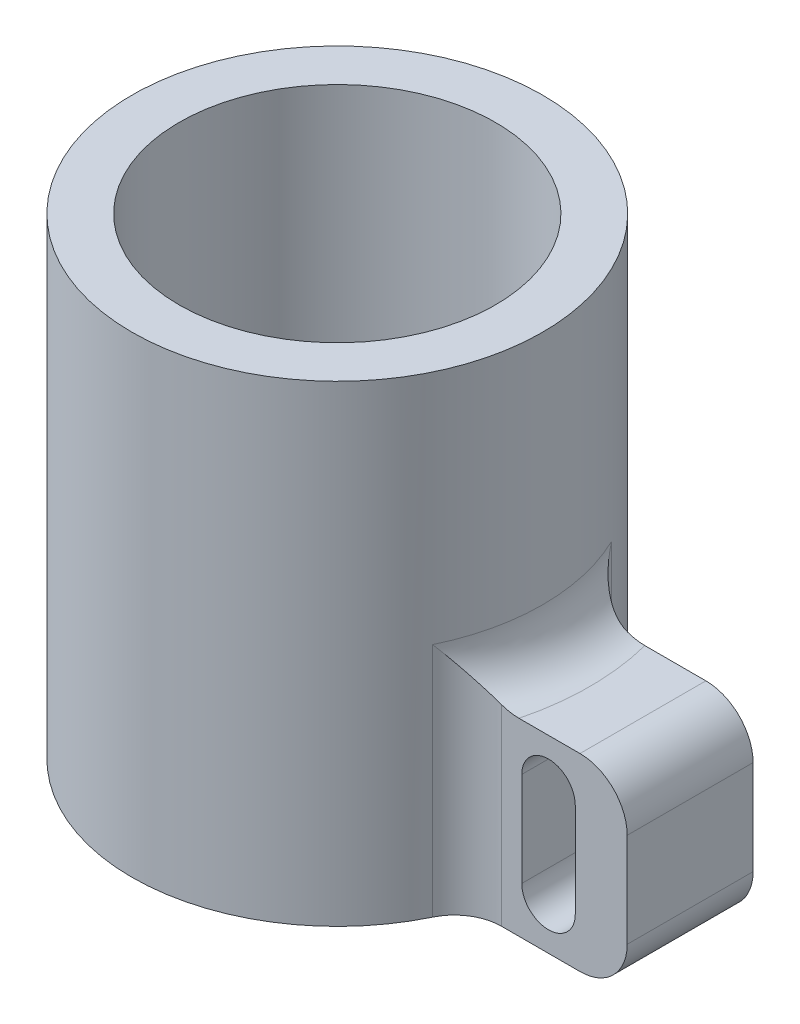
ISO-10303-21;
HEADER;
FILE_DESCRIPTION(('STEP AP214'),'2;1');
FILE_NAME('part.step','',(''),(''),'','','');
FILE_SCHEMA(('AUTOMOTIVE_DESIGN { 1 0 10303 214 1 1 1 1 }'));
ENDSEC;
DATA;
#1=APPLICATION_CONTEXT('core data for automotive mechanical design processes');
#2=APPLICATION_PROTOCOL_DEFINITION('international standard','automotive_design',2000,#1);
#3=PRODUCT_CONTEXT('',#1,'mechanical');
#4=PRODUCT('Part','Part','',(#3));
#5=PRODUCT_RELATED_PRODUCT_CATEGORY('part','',(#4));
#6=PRODUCT_DEFINITION_FORMATION('','',#4);
#7=PRODUCT_DEFINITION_CONTEXT('part definition',#1,'design');
#8=PRODUCT_DEFINITION('design','',#6,#7);
#9=PRODUCT_DEFINITION_SHAPE('','',#8);
#10=(LENGTH_UNIT() NAMED_UNIT(*) SI_UNIT(.MILLI.,.METRE.));
#11=(NAMED_UNIT(*) PLANE_ANGLE_UNIT() SI_UNIT($,.RADIAN.));
#12=(NAMED_UNIT(*) SI_UNIT($,.STERADIAN.) SOLID_ANGLE_UNIT());
#13=UNCERTAINTY_MEASURE_WITH_UNIT(LENGTH_MEASURE(1.E-05),#10,'distance_accuracy_value','');
#14=(GEOMETRIC_REPRESENTATION_CONTEXT(3) GLOBAL_UNCERTAINTY_ASSIGNED_CONTEXT((#13)) GLOBAL_UNIT_ASSIGNED_CONTEXT((#10,
#11,#12)) REPRESENTATION_CONTEXT('',''));
#15=CARTESIAN_POINT('',(0.,0.,0.));
#16=DIRECTION('',(0.,0.,1.));
#17=DIRECTION('',(1.,0.,0.));
#18=AXIS2_PLACEMENT_3D('',#15,#16,#17);
#19=CARTESIAN_POINT('',(0.,15.,0.));
#20=DIRECTION('',(0.,1.,0.));
#21=DIRECTION('',(0.,0.,1.));
#22=AXIS2_PLACEMENT_3D('',#19,#20,#21);
#23=PLANE('',#22);
#24=CARTESIAN_POINT('',(0.,15.,0.));
#25=DIRECTION('',(0.,1.,0.));
#26=DIRECTION('',(0.,0.,1.));
#27=AXIS2_PLACEMENT_3D('',#24,#25,#26);
#28=CIRCLE('',#27,13.05);
#29=CARTESIAN_POINT('',(0.,15.,13.05));
#30=VERTEX_POINT('',#29);
#31=EDGE_CURVE('E198',#30,#30,#28,.T.);
#32=ORIENTED_EDGE('',*,*,#31,.T.);
#33=EDGE_LOOP('',(#32));
#34=FACE_BOUND('',#33,.T.);
#35=CARTESIAN_POINT('',(0.,15.,0.));
#36=DIRECTION('',(0.,1.,0.));
#37=DIRECTION('',(0.,0.,1.));
#38=AXIS2_PLACEMENT_3D('',#35,#36,#37);
#39=CIRCLE('',#38,10.05);
#40=CARTESIAN_POINT('',(0.,15.,10.05));
#41=VERTEX_POINT('',#40);
#42=EDGE_CURVE('E192',#41,#41,#39,.T.);
#43=ORIENTED_EDGE('',*,*,#42,.F.);
#44=EDGE_LOOP('',(#43));
#45=FACE_BOUND('',#44,.T.);
#46=ADVANCED_FACE('F38',(#34,#45),#23,.T.);
#47=CARTESIAN_POINT('',(0.,-15.,0.));
#48=DIRECTION('',(0.,1.,0.));
#49=DIRECTION('',(0.,0.,1.));
#50=AXIS2_PLACEMENT_3D('',#47,#48,#49);
#51=PLANE('',#50);
#52=CARTESIAN_POINT('',(0.,-15.,0.));
#53=DIRECTION('',(0.,1.,0.));
#54=DIRECTION('',(0.,0.,1.));
#55=AXIS2_PLACEMENT_3D('',#52,#53,#54);
#56=CIRCLE('',#55,13.05);
#57=CARTESIAN_POINT('',(11.7434371928295,-15.,-5.69158878504673));
#58=VERTEX_POINT('',#57);
#59=CARTESIAN_POINT('',(11.7434371928295,-15.,5.69158878504673));
#60=VERTEX_POINT('',#59);
#61=EDGE_CURVE('E195',#58,#60,#56,.T.);
#62=ORIENTED_EDGE('',*,*,#61,.F.);
#63=CARTESIAN_POINT('',(14.4430779268132,-15.,-7.));
#64=DIRECTION('',(0.,1.,0.));
#65=DIRECTION('',(0.,0.,1.));
#66=AXIS2_PLACEMENT_3D('',#63,#64,#65);
#67=CIRCLE('',#66,3.);
#68=CARTESIAN_POINT('',(14.4430779268132,-15.,-4.));
#69=VERTEX_POINT('',#68);
#70=EDGE_CURVE('E244',#58,#69,#67,.T.);
#71=ORIENTED_EDGE('',*,*,#70,.T.);
#72=DIRECTION('',(1.,0.,0.));
#73=VECTOR('',#72,1.);
#74=CARTESIAN_POINT('',(12.4218557389788,-15.,-4.));
#75=LINE('',#74,#73);
#76=CARTESIAN_POINT('',(19.4218557389788,-15.,-4.));
#77=VERTEX_POINT('',#76);
#78=EDGE_CURVE('E182',#69,#77,#75,.T.);
#79=ORIENTED_EDGE('',*,*,#78,.T.);
#80=DIRECTION('',(0.,0.,1.));
#81=VECTOR('',#80,1.);
#82=CARTESIAN_POINT('',(19.4218557389788,-15.,0.));
#83=LINE('',#82,#81);
#84=CARTESIAN_POINT('',(19.4218557389788,-15.,4.));
#85=VERTEX_POINT('',#84);
#86=EDGE_CURVE('E212',#77,#85,#83,.T.);
#87=ORIENTED_EDGE('',*,*,#86,.T.);
#88=DIRECTION('',(1.,0.,0.));
#89=VECTOR('',#88,1.);
#90=CARTESIAN_POINT('',(12.4218557389788,-15.,4.));
#91=LINE('',#90,#89);
#92=CARTESIAN_POINT('',(14.4430779268132,-15.,4.));
#93=VERTEX_POINT('',#92);
#94=EDGE_CURVE('E186',#93,#85,#91,.T.);
#95=ORIENTED_EDGE('',*,*,#94,.F.);
#96=CARTESIAN_POINT('',(14.4430779268132,-15.,7.));
#97=DIRECTION('',(0.,1.,0.));
#98=DIRECTION('',(0.,0.,1.));
#99=AXIS2_PLACEMENT_3D('',#96,#97,#98);
#100=CIRCLE('',#99,3.);
#101=EDGE_CURVE('E11',#93,#60,#100,.T.);
#102=ORIENTED_EDGE('',*,*,#101,.T.);
#103=EDGE_LOOP('',(#62,#71,#79,#87,#95,#102));
#104=FACE_BOUND('',#103,.T.);
#105=CARTESIAN_POINT('',(0.,-15.,0.));
#106=DIRECTION('',(0.,1.,0.));
#107=DIRECTION('',(0.,0.,1.));
#108=AXIS2_PLACEMENT_3D('',#105,#106,#107);
#109=CIRCLE('',#108,10.05);
#110=CARTESIAN_POINT('',(0.,-15.,10.05));
#111=VERTEX_POINT('',#110);
#112=EDGE_CURVE('E181',#111,#111,#109,.T.);
#113=ORIENTED_EDGE('',*,*,#112,.T.);
#114=EDGE_LOOP('',(#113));
#115=FACE_BOUND('',#114,.T.);
#116=ADVANCED_FACE('F280',(#104,#115),#51,.F.);
#117=CARTESIAN_POINT('',(0.,15.,0.));
#118=DIRECTION('',(0.,-1.,0.));
#119=DIRECTION('',(0.,0.,-1.));
#120=AXIS2_PLACEMENT_3D('',#117,#118,#119);
#121=CYLINDRICAL_SURFACE('',#120,13.05);
#122=CARTESIAN_POINT('',(-13.05,-1.75,0.));
#123=CARTESIAN_POINT('',(-13.0499985563924,-1.74999588272326,-0.097827401796571));
#124=CARTESIAN_POINT('',(-13.0488883898653,-1.74176929995945,-0.195714439800495));
#125=CARTESIAN_POINT('',(-13.0445665203212,-1.70908409121789,-0.388760454522385));
#126=CARTESIAN_POINT('',(-13.0413526738031,-1.68460890870393,-0.483916545257475));
#127=CARTESIAN_POINT('',(-13.0331851953373,-1.62016416930917,-0.66867831504605));
#128=CARTESIAN_POINT('',(-13.0282327843927,-1.58020548453663,-0.75828783766368));
#129=CARTESIAN_POINT('',(-13.017137756471,-1.48595279800519,-0.929513509045821));
#130=CARTESIAN_POINT('',(-13.01099533027,-1.43166109352307,-1.01113093590114));
#131=CARTESIAN_POINT('',(-12.9981618599946,-1.30991833199,-1.16458562397635));
#132=CARTESIAN_POINT('',(-12.9914679230641,-1.24239493919249,-1.23636526187491));
#133=CARTESIAN_POINT('',(-12.9783089667916,-1.09626102076819,-1.36761021823294));
#134=CARTESIAN_POINT('',(-12.9718439596253,-1.01764990654525,-1.42707488253316));
#135=CARTESIAN_POINT('',(-12.9598465684176,-0.851192959395002,-1.5322200474085));
#136=CARTESIAN_POINT('',(-12.9543179170931,-0.763312331702198,-1.57784592653884));
#137=CARTESIAN_POINT('',(-12.9448579047174,-0.581049314963632,-1.65366947077376));
#138=CARTESIAN_POINT('',(-12.9409264740987,-0.486667209302252,-1.68386780784691));
#139=CARTESIAN_POINT('',(-12.9351339943286,-0.294681472163437,-1.72780254414692));
#140=CARTESIAN_POINT('',(-12.9332606489036,-0.197100600995333,-1.74163675133164));
#141=CARTESIAN_POINT('',(-12.9317589374786,-0.000985698294164454,-1.75275329817794));
#142=CARTESIAN_POINT('',(-12.9321304680065,0.0975482890982762,-1.75003640072308));
#143=CARTESIAN_POINT('',(-12.9350652782109,0.292087599064908,-1.72820802453727));
#144=CARTESIAN_POINT('',(-12.9376140997407,0.388105305492018,-1.70920469200651));
#145=CARTESIAN_POINT('',(-12.9445937446439,0.57557663636558,-1.65551180644757));
#146=CARTESIAN_POINT('',(-12.9490246113803,0.667030155597206,-1.62082189199352));
#147=CARTESIAN_POINT('',(-12.9592853522852,0.843110669259254,-1.53662561936111));
#148=CARTESIAN_POINT('',(-12.9651196136682,0.927715121420581,-1.48707267480534));
#149=CARTESIAN_POINT('',(-12.9775264610578,1.08744873107095,-1.37459024170368));
#150=CARTESIAN_POINT('',(-12.984099085886,1.1625773899008,-1.31166004965398));
#151=CARTESIAN_POINT('',(-12.9973062362529,1.30185418488781,-1.17361209018969));
#152=CARTESIAN_POINT('',(-13.0039408376435,1.36591003471435,-1.0984011858019));
#153=CARTESIAN_POINT('',(-13.0164755103772,1.48050295719231,-0.938246324079526));
#154=CARTESIAN_POINT('',(-13.0223755795617,1.53103999011333,-0.85330233814147));
#155=CARTESIAN_POINT('',(-13.0327808809671,1.61716238429306,-0.676018364287251));
#156=CARTESIAN_POINT('',(-13.0372855309784,1.65274150687982,-0.58367530943374));
#157=CARTESIAN_POINT('',(-13.0443873280105,1.70786247473842,-0.394251517513212));
#158=CARTESIAN_POINT('',(-13.0469845779027,1.72740518490598,-0.2971710362502));
#159=CARTESIAN_POINT('',(-13.0499654790284,1.74977790693332,-0.101825596970833));
#160=CARTESIAN_POINT('',(-13.0503659562746,1.75273495932226,-0.00357543564964309));
#161=CARTESIAN_POINT('',(-13.0489537469753,1.74218835492154,0.192019134335603));
#162=CARTESIAN_POINT('',(-13.0471411148556,1.72868510293126,0.289363565214478));
#163=CARTESIAN_POINT('',(-13.041516801374,1.68570677807283,0.480005147109601));
#164=CARTESIAN_POINT('',(-13.037712760178,1.65629273369958,0.573316301055459));
#165=CARTESIAN_POINT('',(-13.02853123152,1.58239154117193,0.753681878210108));
#166=CARTESIAN_POINT('',(-13.0231536834043,1.53790381196356,0.840736060070989));
#167=CARTESIAN_POINT('',(-13.0113820494466,1.43481393524855,1.00668092740599));
#168=CARTESIAN_POINT('',(-13.0049821597743,1.37613015467847,1.08552048104847));
#169=CARTESIAN_POINT('',(-12.9918987245024,1.24642884481754,1.23227681255569));
#170=CARTESIAN_POINT('',(-12.9852151658812,1.17541074886094,1.30019308830461));
#171=CARTESIAN_POINT('',(-12.9722652549825,1.02249504889266,1.42362968666842));
#172=CARTESIAN_POINT('',(-12.9660019388115,0.940528902727793,1.47906546353303));
#173=CARTESIAN_POINT('',(-12.9546529493295,0.768374201612131,1.57538214282873));
#174=CARTESIAN_POINT('',(-12.9495672494714,0.678185832078578,1.61626337337371));
#175=CARTESIAN_POINT('',(-12.9411704816567,0.492412470678718,1.68217560615089));
#176=CARTESIAN_POINT('',(-12.9378542037258,0.396844248525525,1.70725318139243));
#177=CARTESIAN_POINT('',(-12.9333572079728,0.202805556244793,1.74099566574198));
#178=CARTESIAN_POINT('',(-12.9321763744965,0.104335243586077,1.74966146370188));
#179=CARTESIAN_POINT('',(-12.9320876739287,-0.0918708145439395,1.75031642878322));
#180=CARTESIAN_POINT('',(-12.9331616993896,-0.18960613471769,1.74243844912948));
#181=CARTESIAN_POINT('',(-12.9374226271253,-0.382349614010556,1.71051197355238));
#182=CARTESIAN_POINT('',(-12.9406095285059,-0.47735777428387,1.68646348447288));
#183=CARTESIAN_POINT('',(-12.9487312728053,-0.661925825307327,1.62292209009637));
#184=CARTESIAN_POINT('',(-12.9536652778111,-0.751488303728082,1.58343658746566));
#185=CARTESIAN_POINT('',(-12.9647265380302,-0.922738176217012,1.49015507277252));
#186=CARTESIAN_POINT('',(-12.9708538170472,-1.00442541313879,1.43635877522602));
#187=CARTESIAN_POINT('',(-12.9836700808909,-1.15828383083422,1.31549319923627));
#188=CARTESIAN_POINT('',(-12.9903630211887,-1.23037704171104,1.24832507820943));
#189=CARTESIAN_POINT('',(-13.003522196318,-1.36231821730162,1.10283023224923));
#190=CARTESIAN_POINT('',(-13.0099883776229,-1.42216330675182,1.02450089450814));
#191=CARTESIAN_POINT('',(-13.0219971273949,-1.52813658666539,0.85851019141404));
#192=CARTESIAN_POINT('',(-13.0275355360871,-1.57420368993159,0.770809540041309));
#193=CARTESIAN_POINT('',(-13.0370231811908,-1.65088872495103,0.588888569305103));
#194=CARTESIAN_POINT('',(-13.0409741158691,-1.68152317538436,0.494675344226775));
#195=CARTESIAN_POINT('',(-13.0459064574379,-1.7192709163097,0.333330013068887));
#196=CARTESIAN_POINT('',(-13.0474339196314,-1.73077740659693,0.267208467457927));
#197=CARTESIAN_POINT('',(-13.0494811810959,-1.74614332508655,0.134067280116709));
#198=CARTESIAN_POINT('',(-13.0500009894006,-1.75000282184449,0.0670476464432641));
#199=CARTESIAN_POINT('',(-13.05,-1.75,0.));
#200=B_SPLINE_CURVE_WITH_KNOTS('',3,(#122,#123,#124,#125,#126,#127,#128,#129,#130,#131,#132,
#133,#134,#135,#136,#137,#138,#139,#140,#141,#142,#143,#144,#145,#146,#147,#148,#149,#150,#151,
#152,#153,#154,#155,#156,#157,#158,#159,#160,#161,#162,#163,#164,#165,#166,#167,#168,#169,#170,
#171,#172,#173,#174,#175,#176,#177,#178,#179,#180,#181,#182,#183,#184,#185,#186,#187,#188,#189,
#190,#191,#192,#193,#194,#195,#196,#197,#198,#199),.UNSPECIFIED.,.T.,.F.,(4,2,2,2,2,2,2,2,2,2,2,
2,2,2,2,2,2,2,2,2,2,2,2,2,2,2,2,2,2,2,2,2,2,2,2,2,2,2,4),(0.,0.293237269596652,
0.586773793314364,0.880104575816512,1.17338837217571,1.46832264274902,1.76327257592389,
2.05937195987793,2.35545844570166,2.64976614182797,2.94406027264798,3.2364152215197,
3.52877690672338,3.82206471441829,4.11536794981299,4.4110087957341,4.7066505105033,
5.00241541000949,5.29816435690692,5.59164484074128,5.88511810731402,6.17747360874801,
6.46984038105926,6.76393010823039,7.05803335011035,7.35407267315812,7.65010532194988,
7.94526143873537,8.24040156958768,8.53318067238647,8.82595965127237,9.11859840278422,
9.41124299254371,9.70613695318201,10.0011000613844,10.2973521892932,10.5932865398468,
10.7942634101059,10.9952384785922),.UNSPECIFIED.);
#201=CARTESIAN_POINT('',(-13.05,-1.75,0.));
#202=VERTEX_POINT('',#201);
#203=EDGE_CURVE('E291',#202,#202,#200,.T.);
#204=ORIENTED_EDGE('',*,*,#203,.T.);
#205=EDGE_LOOP('',(#204));
#206=FACE_BOUND('',#205,.T.);
#207=ORIENTED_EDGE('',*,*,#31,.F.);
#208=EDGE_LOOP('',(#207));
#209=FACE_BOUND('',#208,.T.);
#210=CARTESIAN_POINT('',(0.,0.,0.));
#211=DIRECTION('',(0.,1.,0.));
#212=DIRECTION('',(0.,0.,1.));
#213=AXIS2_PLACEMENT_3D('',#210,#211,#212);
#214=CIRCLE('',#213,13.05);
#215=CARTESIAN_POINT('',(11.7434371928295,0.,5.69158878504673));
#216=VERTEX_POINT('',#215);
#217=CARTESIAN_POINT('',(11.7434371928295,0.,-5.69158878504673));
#218=VERTEX_POINT('',#217);
#219=EDGE_CURVE('E235',#216,#218,#214,.T.);
#220=ORIENTED_EDGE('',*,*,#219,.T.);
#221=DIRECTION('',(0.,-1.,0.));
#222=VECTOR('',#221,1.);
#223=CARTESIAN_POINT('',(11.7434371928295,15.,-5.69158878504673));
#224=LINE('',#223,#222);
#225=EDGE_CURVE('E237',#218,#58,#224,.T.);
#226=ORIENTED_EDGE('',*,*,#225,.T.);
#227=ORIENTED_EDGE('',*,*,#61,.T.);
#228=DIRECTION('',(0.,-1.,0.));
#229=VECTOR('',#228,1.);
#230=CARTESIAN_POINT('',(11.7434371928295,15.,5.69158878504673));
#231=LINE('',#230,#229);
#232=EDGE_CURVE('E233',#60,#216,#231,.F.);
#233=ORIENTED_EDGE('',*,*,#232,.T.);
#234=EDGE_LOOP('',(#220,#226,#227,#233));
#235=FACE_BOUND('',#234,.T.);
#236=ADVANCED_FACE('F276',(#206,#209,#235),#121,.T.);
#237=CARTESIAN_POINT('',(0.,15.,0.));
#238=DIRECTION('',(0.,-1.,0.));
#239=DIRECTION('',(0.,0.,-1.));
#240=AXIS2_PLACEMENT_3D('',#237,#238,#239);
#241=CYLINDRICAL_SURFACE('',#240,10.05);
#242=CARTESIAN_POINT('',(-9.8964640149904,0.,-1.75));
#243=CARTESIAN_POINT('',(-9.89646582554457,0.097495416346956,-1.7499961395764));
#244=CARTESIAN_POINT('',(-9.89792035980209,0.195042449569785,-1.74182494173534));
#245=CARTESIAN_POINT('',(-9.90357537026776,0.387394834900348,-1.70937294209134));
#246=CARTESIAN_POINT('',(-9.90777830862256,0.48219764901277,-1.68507769533353));
#247=CARTESIAN_POINT('',(-9.91844000147646,0.666250207357816,-1.62113880276861));
#248=CARTESIAN_POINT('',(-9.92489679583479,0.755504697670602,-1.58150849037104));
#249=CARTESIAN_POINT('',(-9.93933636611461,0.926089518704409,-1.48805839944354));
#250=CARTESIAN_POINT('',(-9.94731898856793,1.00742064511844,-1.43424004774395));
#251=CARTESIAN_POINT('',(-9.96400663747448,1.16073269508696,-1.31332468396496));
#252=CARTESIAN_POINT('',(-9.97271787755467,1.23261608830375,-1.246104850468));
#253=CARTESIAN_POINT('',(-9.98982613918473,1.36414412708469,-1.10056009874466));
#254=CARTESIAN_POINT('',(-9.99822314141047,1.42378802098604,-1.0222344989805));
#255=CARTESIAN_POINT('',(-10.0138228626768,1.52951276110551,-0.856066564165167));
#256=CARTESIAN_POINT('',(-10.0210174176741,1.57550241685897,-0.768165377039047));
#257=CARTESIAN_POINT('',(-10.0333323232435,1.65202659582531,-0.585738782250155));
#258=CARTESIAN_POINT('',(-10.038452820927,1.68256221521928,-0.491213844962871));
#259=CARTESIAN_POINT('',(-10.045998796879,1.72701206267659,-0.299231748526256));
#260=CARTESIAN_POINT('',(-10.0484508615009,1.74109036635996,-0.201813640124614));
#261=CARTESIAN_POINT('',(-10.0504751361319,1.75273651228649,-0.00596928086338834));
#262=CARTESIAN_POINT('',(-10.050047558988,1.75030557480035,0.0924568949485425));
#263=CARTESIAN_POINT('',(-10.0463816790969,1.72912946769315,0.286400436703499));
#264=CARTESIAN_POINT('',(-10.0431738045581,1.71056090590763,0.381937743603385));
#265=CARTESIAN_POINT('',(-10.0343417541777,1.65791516048391,0.568519509625335));
#266=CARTESIAN_POINT('',(-10.0287174995688,1.62383747128845,0.659563822180213));
#267=CARTESIAN_POINT('',(-10.0156331383366,1.54096780870657,0.83509593051701));
#268=CARTESIAN_POINT('',(-10.0081640797648,1.49210381611275,0.919549031136379));
#269=CARTESIAN_POINT('',(-9.99221863350612,1.38110147990128,1.07912336004458));
#270=CARTESIAN_POINT('',(-9.98374215706096,1.31896196626182,1.15424376488418));
#271=CARTESIAN_POINT('',(-9.96659082835254,1.18219511381974,1.29406481255784));
#272=CARTESIAN_POINT('',(-9.95791483542922,1.10741335832893,1.35861436274493));
#273=CARTESIAN_POINT('',(-9.94145039491842,0.948003038442764,1.47427522844679));
#274=CARTESIAN_POINT('',(-9.93366195704029,0.863374366348342,1.52538639696146));
#275=CARTESIAN_POINT('',(-9.91985348467895,0.686488653035931,1.61275391769555));
#276=CARTESIAN_POINT('',(-9.91383577286097,0.59422179415073,1.64899078363707));
#277=CARTESIAN_POINT('',(-9.90428746456399,0.404782027099698,1.70540802472593));
#278=CARTESIAN_POINT('',(-9.90075662767014,0.307609594146403,1.72558995198453));
#279=CARTESIAN_POINT('',(-9.89662873914726,0.112472579895809,1.74910897191374));
#280=CARTESIAN_POINT('',(-9.89599407642953,0.0145347988228404,1.75266203057655));
#281=CARTESIAN_POINT('',(-9.89763005513171,-0.180535507874192,1.74339914804347));
#282=CARTESIAN_POINT('',(-9.8999005735731,-0.27766806740872,1.73058389973047));
#283=CARTESIAN_POINT('',(-9.9070562365933,-0.467676423194143,1.68913276006805));
#284=CARTESIAN_POINT('',(-9.91192301912573,-0.560577200779348,1.66060792924459));
#285=CARTESIAN_POINT('',(-9.92370729820439,-0.740280237642257,1.58866428543768));
#286=CARTESIAN_POINT('',(-9.9306249274252,-0.827082101915904,1.54524450883302));
#287=CARTESIAN_POINT('',(-9.9458182493305,-0.993081142632104,1.44423817314701));
#288=CARTESIAN_POINT('',(-9.95410686688024,-1.07219331624437,1.38651389575672));
#289=CARTESIAN_POINT('',(-9.97107095246049,-1.21968607185312,1.25872501039633));
#290=CARTESIAN_POINT('',(-9.97974645025832,-1.28806582624035,1.18865945163604));
#291=CARTESIAN_POINT('',(-9.99662641354444,-1.41294759724331,1.03721738600696));
#292=CARTESIAN_POINT('',(-10.0048243738865,-1.46930516211612,0.955720925198137));
#293=CARTESIAN_POINT('',(-10.0197195074543,-1.56752832890225,0.784291243698772));
#294=CARTESIAN_POINT('',(-10.0264167325715,-1.60939443191978,0.694358314871856));
#295=CARTESIAN_POINT('',(-10.0375276293019,-1.67722439570101,0.509027286716373));
#296=CARTESIAN_POINT('',(-10.0419519087736,-1.70326223350402,0.413656925961947));
#297=CARTESIAN_POINT('',(-10.0480634081711,-1.73893407605013,0.219813331304631));
#298=CARTESIAN_POINT('',(-10.0497508748597,-1.74856955970379,0.121340377961072));
#299=CARTESIAN_POINT('',(-10.0501946393663,-1.7511175275244,-0.0745220285859392));
#300=CARTESIAN_POINT('',(-10.0489893615036,-1.7442492299488,-0.17190861191853));
#301=CARTESIAN_POINT('',(-10.043861984232,-1.71446081882363,-0.364118251703793));
#302=CARTESIAN_POINT('',(-10.0399399035519,-1.69154081593022,-0.458941325823932));
#303=CARTESIAN_POINT('',(-10.0298184923501,-1.63038664996739,-0.643237391349006));
#304=CARTESIAN_POINT('',(-10.0236221775207,-1.59217276093989,-0.732717286083055));
#305=CARTESIAN_POINT('',(-10.0096267420965,-1.5015405857179,-0.904028793454478));
#306=CARTESIAN_POINT('',(-10.0018275344277,-1.44912152780578,-0.985859990239661));
#307=CARTESIAN_POINT('',(-9.98536711343736,-1.33079756998454,-1.14065153434273));
#308=CARTESIAN_POINT('',(-9.97669637476164,-1.26473285483198,-1.21348871829188));
#309=CARTESIAN_POINT('',(-9.95953402718203,-1.12132721014361,-1.34712006997246));
#310=CARTESIAN_POINT('',(-9.95104246073343,-1.04398364165354,-1.40791141142101));
#311=CARTESIAN_POINT('',(-9.93512801710715,-0.879496685190367,-1.51616520369212));
#312=CARTESIAN_POINT('',(-9.92771399925795,-0.792281514668201,-1.56351990830858));
#313=CARTESIAN_POINT('',(-9.91489937206934,-0.611037902090276,-1.6428323249356));
#314=CARTESIAN_POINT('',(-9.90949679051354,-0.517016242454072,-1.67480512796219));
#315=CARTESIAN_POINT('',(-9.9024903793224,-0.352214774259403,-1.7156550530571));
#316=CARTESIAN_POINT('',(-9.90024334876755,-0.282422076587205,-1.72851326668287));
#317=CARTESIAN_POINT('',(-9.89722952388374,-0.141762001835256,-1.74568705391226));
#318=CARTESIAN_POINT('',(-9.89646269843005,-0.070894647384227,-1.75000280714089));
#319=CARTESIAN_POINT('',(-9.8964640149904,0.,-1.75));
#320=B_SPLINE_CURVE_WITH_KNOTS('',3,(#242,#243,#244,#245,#246,#247,#248,#249,#250,#251,#252,
#253,#254,#255,#256,#257,#258,#259,#260,#261,#262,#263,#264,#265,#266,#267,#268,#269,#270,#271,
#272,#273,#274,#275,#276,#277,#278,#279,#280,#281,#282,#283,#284,#285,#286,#287,#288,#289,#290,
#291,#292,#293,#294,#295,#296,#297,#298,#299,#300,#301,#302,#303,#304,#305,#306,#307,#308,#309,
#310,#311,#312,#313,#314,#315,#316,#317,#318,#319),.UNSPECIFIED.,.T.,.F.,(4,2,2,2,2,2,2,2,2,2,2,
2,2,2,2,2,2,2,2,2,2,2,2,2,2,2,2,2,2,2,2,2,2,2,2,2,2,2,4),(0.,0.292226936351181,
0.584716022319593,0.876951366597321,1.16915733322168,1.464175784116,1.75921234752166,
2.05617715553036,2.35312089636691,2.64707822281768,2.94101382182505,3.2317725711666,
3.52254079916682,3.81474870383536,4.10698237252236,4.40308442771716,4.69918972178539,
4.99568170389768,5.2921450191617,5.58474715592525,5.87733690702827,6.16788423402485,
6.45845036138447,6.75193072602828,7.04543371072198,7.34228610010896,7.63912822353103,
7.93457210110761,8.2299893387145,8.52150431434523,8.81301728036948,9.10414508116505,
9.39528870109724,9.69005805333946,9.98489648482356,10.2820363558935,10.5788841087517,
10.7913839577558,11.0038793384111),.UNSPECIFIED.);
#321=CARTESIAN_POINT('',(-9.8964640149904,0.,-1.75));
#322=VERTEX_POINT('',#321);
#323=EDGE_CURVE('E43',#322,#322,#320,.T.);
#324=ORIENTED_EDGE('',*,*,#323,.F.);
#325=EDGE_LOOP('',(#324));
#326=FACE_BOUND('',#325,.T.);
#327=ORIENTED_EDGE('',*,*,#42,.T.);
#328=EDGE_LOOP('',(#327));
#329=FACE_BOUND('',#328,.T.);
#330=ORIENTED_EDGE('',*,*,#112,.F.);
#331=EDGE_LOOP('',(#330));
#332=FACE_BOUND('',#331,.T.);
#333=ADVANCED_FACE('F272',(#326,#329,#332),#241,.F.);
#334=CARTESIAN_POINT('',(12.4218557389788,-3.,4.));
#335=DIRECTION('',(0.,1.,0.));
#336=DIRECTION('',(0.,0.,1.));
#337=AXIS2_PLACEMENT_3D('',#334,#335,#336);
#338=PLANE('',#337);
#339=DIRECTION('',(1.,0.,0.));
#340=VECTOR('',#339,1.);
#341=CARTESIAN_POINT('',(12.4218557389788,-3.,-4.));
#342=LINE('',#341,#340);
#343=CARTESIAN_POINT('',(15.5435678015055,-3.,-4.));
#344=VERTEX_POINT('',#343);
#345=CARTESIAN_POINT('',(19.4218557389788,-3.,-4.));
#346=VERTEX_POINT('',#345);
#347=EDGE_CURVE('E175',#344,#346,#342,.T.);
#348=ORIENTED_EDGE('',*,*,#347,.F.);
#349=CARTESIAN_POINT('',(0.,-3.,0.));
#350=DIRECTION('',(0.,1.,0.));
#351=DIRECTION('',(0.,0.,1.));
#352=AXIS2_PLACEMENT_3D('',#349,#350,#351);
#353=CIRCLE('',#352,16.05);
#354=CARTESIAN_POINT('',(15.5435678015055,-3.,4.));
#355=VERTEX_POINT('',#354);
#356=EDGE_CURVE('E241',#344,#355,#353,.F.);
#357=ORIENTED_EDGE('',*,*,#356,.T.);
#358=DIRECTION('',(1.,0.,0.));
#359=VECTOR('',#358,1.);
#360=CARTESIAN_POINT('',(12.4218557389788,-3.,4.));
#361=LINE('',#360,#359);
#362=CARTESIAN_POINT('',(19.4218557389788,-3.,4.));
#363=VERTEX_POINT('',#362);
#364=EDGE_CURVE('E187',#355,#363,#361,.T.);
#365=ORIENTED_EDGE('',*,*,#364,.T.);
#366=DIRECTION('',(0.,0.,1.));
#367=VECTOR('',#366,1.);
#368=CARTESIAN_POINT('',(19.4218557389788,-3.,-4.));
#369=LINE('',#368,#367);
#370=EDGE_CURVE('E230',#363,#346,#369,.F.);
#371=ORIENTED_EDGE('',*,*,#370,.T.);
#372=EDGE_LOOP('',(#348,#357,#365,#371));
#373=FACE_BOUND('',#372,.T.);
#374=ADVANCED_FACE('F266',(#373),#338,.T.);
#375=CARTESIAN_POINT('',(12.4218557389788,15.,4.));
#376=DIRECTION('',(0.,0.,1.));
#377=DIRECTION('',(1.,0.,0.));
#378=AXIS2_PLACEMENT_3D('',#375,#376,#377);
#379=PLANE('',#378);
#380=CARTESIAN_POINT('',(17.4218557389788,-12.,4.));
#381=DIRECTION('',(0.,0.,1.));
#382=DIRECTION('',(1.,0.,0.));
#383=AXIS2_PLACEMENT_3D('',#380,#381,#382);
#384=CIRCLE('',#383,1.7);
#385=CARTESIAN_POINT('',(15.7218557389788,-12.,4.));
#386=VERTEX_POINT('',#385);
#387=CARTESIAN_POINT('',(19.1218557389788,-12.,4.));
#388=VERTEX_POINT('',#387);
#389=EDGE_CURVE('E163',#386,#388,#384,.T.);
#390=ORIENTED_EDGE('',*,*,#389,.F.);
#391=DIRECTION('',(0.,-1.,0.));
#392=VECTOR('',#391,1.);
#393=CARTESIAN_POINT('',(15.7218557389788,-12.,4.));
#394=LINE('',#393,#392);
#395=CARTESIAN_POINT('',(15.7218557389788,-6.,4.));
#396=VERTEX_POINT('',#395);
#397=EDGE_CURVE('E168',#396,#386,#394,.T.);
#398=ORIENTED_EDGE('',*,*,#397,.F.);
#399=CARTESIAN_POINT('',(17.4218557389788,-6.,4.));
#400=DIRECTION('',(0.,0.,1.));
#401=DIRECTION('',(1.,0.,0.));
#402=AXIS2_PLACEMENT_3D('',#399,#400,#401);
#403=CIRCLE('',#402,1.7);
#404=CARTESIAN_POINT('',(19.1218557389788,-6.,4.));
#405=VERTEX_POINT('',#404);
#406=EDGE_CURVE('E147',#405,#396,#403,.T.);
#407=ORIENTED_EDGE('',*,*,#406,.F.);
#408=DIRECTION('',(0.,1.,0.));
#409=VECTOR('',#408,1.);
#410=CARTESIAN_POINT('',(19.1218557389788,-12.,4.));
#411=LINE('',#410,#409);
#412=EDGE_CURVE('E158',#388,#405,#411,.T.);
#413=ORIENTED_EDGE('',*,*,#412,.F.);
#414=EDGE_LOOP('',(#390,#398,#407,#413));
#415=FACE_BOUND('',#414,.T.);
#416=CARTESIAN_POINT('',(15.5435678015055,-3.,4.));
#417=CARTESIAN_POINT('',(15.4495974408814,-3.00000841677031,4.));
#418=CARTESIAN_POINT('',(15.3556304867879,-2.9958590576116,4.));
#419=CARTESIAN_POINT('',(15.1691331925689,-2.97940000337862,4.));
#420=CARTESIAN_POINT('',(15.0765973617585,-2.96715252023858,4.));
#421=CARTESIAN_POINT('',(14.8929467243151,-2.93464992684402,4.));
#422=CARTESIAN_POINT('',(14.8018318625068,-2.9143951283168,4.));
#423=CARTESIAN_POINT('',(14.6210192650398,-2.86585422405301,4.));
#424=CARTESIAN_POINT('',(14.5313377088288,-2.8375078472505,4.));
#425=CARTESIAN_POINT('',(14.4430779268132,-2.80526059074834,4.));
#426=B_SPLINE_CURVE_WITH_KNOTS('',3,(#416,#417,#418,#419,#420,#421,#422,#423,#424,#425),
.UNSPECIFIED.,.F.,.F.,(4,2,2,2,4),(0.,0.281814410661916,0.561488618009073,0.84115193862431,
1.12295529673699),.UNSPECIFIED.);
#427=CARTESIAN_POINT('',(14.4430779268132,-2.80526059074834,4.));
#428=VERTEX_POINT('',#427);
#429=EDGE_CURVE('E246',#355,#428,#426,.T.);
#430=ORIENTED_EDGE('',*,*,#429,.T.);
#431=DIRECTION('',(0.,-1.,0.));
#432=VECTOR('',#431,1.);
#433=CARTESIAN_POINT('',(14.4430779268132,15.,4.));
#434=LINE('',#433,#432);
#435=EDGE_CURVE('E61',#428,#93,#434,.T.);
#436=ORIENTED_EDGE('',*,*,#435,.T.);
#437=ORIENTED_EDGE('',*,*,#94,.T.);
#438=CARTESIAN_POINT('',(19.4218557389788,-12.,4.));
#439=DIRECTION('',(0.,0.,1.));
#440=DIRECTION('',(1.,0.,0.));
#441=AXIS2_PLACEMENT_3D('',#438,#439,#440);
#442=CIRCLE('',#441,3.);
#443=CARTESIAN_POINT('',(22.4218557389788,-12.,4.));
#444=VERTEX_POINT('',#443);
#445=EDGE_CURVE('E218',#85,#444,#442,.T.);
#446=ORIENTED_EDGE('',*,*,#445,.T.);
#447=DIRECTION('',(0.,-1.,0.));
#448=VECTOR('',#447,1.);
#449=CARTESIAN_POINT('',(22.4218557389788,15.,4.));
#450=LINE('',#449,#448);
#451=CARTESIAN_POINT('',(22.4218557389788,-6.,4.));
#452=VERTEX_POINT('',#451);
#453=EDGE_CURVE('E183',#452,#444,#450,.T.);
#454=ORIENTED_EDGE('',*,*,#453,.F.);
#455=CARTESIAN_POINT('',(19.4218557389788,-6.,4.));
#456=DIRECTION('',(0.,0.,1.));
#457=DIRECTION('',(1.,0.,0.));
#458=AXIS2_PLACEMENT_3D('',#455,#456,#457);
#459=CIRCLE('',#458,3.);
#460=EDGE_CURVE('E215',#452,#363,#459,.T.);
#461=ORIENTED_EDGE('',*,*,#460,.T.);
#462=ORIENTED_EDGE('',*,*,#364,.F.);
#463=EDGE_LOOP('',(#430,#436,#437,#446,#454,#461,#462));
#464=FACE_BOUND('',#463,.T.);
#465=ADVANCED_FACE('F165',(#415,#464),#379,.T.);
#466=CARTESIAN_POINT('',(12.4218557389788,15.,-4.));
#467=DIRECTION('',(0.,0.,1.));
#468=DIRECTION('',(1.,0.,0.));
#469=AXIS2_PLACEMENT_3D('',#466,#467,#468);
#470=PLANE('',#469);
#471=DIRECTION('',(0.,-1.,0.));
#472=VECTOR('',#471,1.);
#473=CARTESIAN_POINT('',(15.7218557389788,15.,-4.));
#474=LINE('',#473,#472);
#475=CARTESIAN_POINT('',(15.7218557389788,-6.,-4.));
#476=VERTEX_POINT('',#475);
#477=CARTESIAN_POINT('',(15.7218557389788,-12.,-4.));
#478=VERTEX_POINT('',#477);
#479=EDGE_CURVE('E206',#476,#478,#474,.T.);
#480=ORIENTED_EDGE('',*,*,#479,.T.);
#481=CARTESIAN_POINT('',(17.4218557389788,-12.,-4.));
#482=DIRECTION('',(0.,0.,1.));
#483=DIRECTION('',(1.,0.,0.));
#484=AXIS2_PLACEMENT_3D('',#481,#482,#483);
#485=CIRCLE('',#484,1.7);
#486=CARTESIAN_POINT('',(19.1218557389788,-12.,-4.));
#487=VERTEX_POINT('',#486);
#488=EDGE_CURVE('E209',#478,#487,#485,.T.);
#489=ORIENTED_EDGE('',*,*,#488,.T.);
#490=DIRECTION('',(0.,1.,0.));
#491=VECTOR('',#490,1.);
#492=CARTESIAN_POINT('',(19.1218557389788,15.,-4.));
#493=LINE('',#492,#491);
#494=CARTESIAN_POINT('',(19.1218557389788,-6.,-4.));
#495=VERTEX_POINT('',#494);
#496=EDGE_CURVE('E201',#487,#495,#493,.T.);
#497=ORIENTED_EDGE('',*,*,#496,.T.);
#498=CARTESIAN_POINT('',(17.4218557389788,-6.,-4.));
#499=DIRECTION('',(0.,0.,1.));
#500=DIRECTION('',(1.,0.,0.));
#501=AXIS2_PLACEMENT_3D('',#498,#499,#500);
#502=CIRCLE('',#501,1.7);
#503=EDGE_CURVE('E150',#495,#476,#502,.T.);
#504=ORIENTED_EDGE('',*,*,#503,.T.);
#505=EDGE_LOOP('',(#480,#489,#497,#504));
#506=FACE_BOUND('',#505,.T.);
#507=ORIENTED_EDGE('',*,*,#78,.F.);
#508=DIRECTION('',(0.,1.,0.));
#509=VECTOR('',#508,1.);
#510=CARTESIAN_POINT('',(14.4430779268132,-3.,-4.));
#511=LINE('',#510,#509);
#512=CARTESIAN_POINT('',(14.4430779268132,-2.80526059074834,-4.));
#513=VERTEX_POINT('',#512);
#514=EDGE_CURVE('E69',#69,#513,#511,.T.);
#515=ORIENTED_EDGE('',*,*,#514,.T.);
#516=CARTESIAN_POINT('',(14.4430779268132,-2.80526059074834,-4.));
#517=CARTESIAN_POINT('',(14.5313377088288,-2.8375078472505,-4.));
#518=CARTESIAN_POINT('',(14.6210192650398,-2.86585422405301,-4.));
#519=CARTESIAN_POINT('',(14.8018318625068,-2.9143951283168,-4.));
#520=CARTESIAN_POINT('',(14.8929467243151,-2.93464992684402,-4.));
#521=CARTESIAN_POINT('',(15.0765973617585,-2.96715252023858,-4.));
#522=CARTESIAN_POINT('',(15.1691331925689,-2.97940000337862,-4.));
#523=CARTESIAN_POINT('',(15.3556304867879,-2.9958590576116,-4.));
#524=CARTESIAN_POINT('',(15.4495974408814,-3.00000841677031,-4.));
#525=CARTESIAN_POINT('',(15.5435678015055,-3.,-4.));
#526=B_SPLINE_CURVE_WITH_KNOTS('',3,(#516,#517,#518,#519,#520,#521,#522,#523,#524,#525),
.UNSPECIFIED.,.F.,.F.,(4,2,2,2,4),(0.,0.281803358112676,0.561466678727913,0.841140886075071,
1.12295529673699),.UNSPECIFIED.);
#527=EDGE_CURVE('E53',#513,#344,#526,.T.);
#528=ORIENTED_EDGE('',*,*,#527,.T.);
#529=ORIENTED_EDGE('',*,*,#347,.T.);
#530=CARTESIAN_POINT('',(19.4218557389788,-6.,-4.));
#531=DIRECTION('',(0.,0.,1.));
#532=DIRECTION('',(1.,0.,0.));
#533=AXIS2_PLACEMENT_3D('',#530,#531,#532);
#534=CIRCLE('',#533,3.);
#535=CARTESIAN_POINT('',(22.4218557389788,-6.,-4.));
#536=VERTEX_POINT('',#535);
#537=EDGE_CURVE('E225',#346,#536,#534,.F.);
#538=ORIENTED_EDGE('',*,*,#537,.T.);
#539=DIRECTION('',(0.,-1.,0.));
#540=VECTOR('',#539,1.);
#541=CARTESIAN_POINT('',(22.4218557389788,15.,-4.));
#542=LINE('',#541,#540);
#543=CARTESIAN_POINT('',(22.4218557389788,-12.,-4.));
#544=VERTEX_POINT('',#543);
#545=EDGE_CURVE('E178',#536,#544,#542,.T.);
#546=ORIENTED_EDGE('',*,*,#545,.T.);
#547=CARTESIAN_POINT('',(19.4218557389788,-12.,-4.));
#548=DIRECTION('',(0.,0.,1.));
#549=DIRECTION('',(1.,0.,0.));
#550=AXIS2_PLACEMENT_3D('',#547,#548,#549);
#551=CIRCLE('',#550,3.);
#552=EDGE_CURVE('E227',#544,#77,#551,.F.);
#553=ORIENTED_EDGE('',*,*,#552,.T.);
#554=EDGE_LOOP('',(#507,#515,#528,#529,#538,#546,#553));
#555=FACE_BOUND('',#554,.T.);
#556=ADVANCED_FACE('F265',(#506,#555),#470,.F.);
#557=CARTESIAN_POINT('',(22.4218557389788,-15.,0.));
#558=DIRECTION('',(-1.,0.,0.));
#559=DIRECTION('',(0.,0.,1.));
#560=AXIS2_PLACEMENT_3D('',#557,#558,#559);
#561=PLANE('',#560);
#562=ORIENTED_EDGE('',*,*,#453,.T.);
#563=DIRECTION('',(0.,0.,1.));
#564=VECTOR('',#563,1.);
#565=CARTESIAN_POINT('',(22.4218557389788,-12.,0.));
#566=LINE('',#565,#564);
#567=EDGE_CURVE('E223',#444,#544,#566,.F.);
#568=ORIENTED_EDGE('',*,*,#567,.T.);
#569=ORIENTED_EDGE('',*,*,#545,.F.);
#570=DIRECTION('',(0.,0.,1.));
#571=VECTOR('',#570,1.);
#572=CARTESIAN_POINT('',(22.4218557389788,-6.,4.));
#573=LINE('',#572,#571);
#574=EDGE_CURVE('E220',#536,#452,#573,.T.);
#575=ORIENTED_EDGE('',*,*,#574,.T.);
#576=EDGE_LOOP('',(#562,#568,#569,#575));
#577=FACE_BOUND('',#576,.T.);
#578=ADVANCED_FACE('F270',(#577),#561,.F.);
#579=CARTESIAN_POINT('',(17.4218557389788,-12.,-13.05));
#580=DIRECTION('',(0.,0.,1.));
#581=DIRECTION('',(1.,0.,0.));
#582=AXIS2_PLACEMENT_3D('',#579,#580,#581);
#583=CYLINDRICAL_SURFACE('',#582,1.7);
#584=DIRECTION('',(0.,0.,1.));
#585=VECTOR('',#584,1.);
#586=CARTESIAN_POINT('',(15.7218557389788,-12.,-13.05));
#587=LINE('',#586,#585);
#588=EDGE_CURVE('E173',#478,#386,#587,.T.);
#589=ORIENTED_EDGE('',*,*,#588,.T.);
#590=ORIENTED_EDGE('',*,*,#389,.T.);
#591=DIRECTION('',(0.,0.,1.));
#592=VECTOR('',#591,1.);
#593=CARTESIAN_POINT('',(19.1218557389788,-12.,-13.05));
#594=LINE('',#593,#592);
#595=EDGE_CURVE('E154',#487,#388,#594,.T.);
#596=ORIENTED_EDGE('',*,*,#595,.F.);
#597=ORIENTED_EDGE('',*,*,#488,.F.);
#598=EDGE_LOOP('',(#589,#590,#596,#597));
#599=FACE_BOUND('',#598,.T.);
#600=ADVANCED_FACE('F307',(#599),#583,.F.);
#601=CARTESIAN_POINT('',(15.7218557389788,-12.,-13.05));
#602=DIRECTION('',(-1.,0.,0.));
#603=DIRECTION('',(0.,-1.,0.));
#604=AXIS2_PLACEMENT_3D('',#601,#602,#603);
#605=PLANE('',#604);
#606=DIRECTION('',(0.,0.,1.));
#607=VECTOR('',#606,1.);
#608=CARTESIAN_POINT('',(15.7218557389788,-6.,-13.05));
#609=LINE('',#608,#607);
#610=EDGE_CURVE('E153',#476,#396,#609,.T.);
#611=ORIENTED_EDGE('',*,*,#610,.T.);
#612=ORIENTED_EDGE('',*,*,#397,.T.);
#613=ORIENTED_EDGE('',*,*,#588,.F.);
#614=ORIENTED_EDGE('',*,*,#479,.F.);
#615=EDGE_LOOP('',(#611,#612,#613,#614));
#616=FACE_BOUND('',#615,.T.);
#617=ADVANCED_FACE('F303',(#616),#605,.F.);
#618=CARTESIAN_POINT('',(17.4218557389788,-6.,-13.05));
#619=DIRECTION('',(0.,0.,1.));
#620=DIRECTION('',(1.,0.,0.));
#621=AXIS2_PLACEMENT_3D('',#618,#619,#620);
#622=CYLINDRICAL_SURFACE('',#621,1.7);
#623=DIRECTION('',(0.,0.,1.));
#624=VECTOR('',#623,1.);
#625=CARTESIAN_POINT('',(19.1218557389788,-6.,-13.05));
#626=LINE('',#625,#624);
#627=EDGE_CURVE('E142',#495,#405,#626,.T.);
#628=ORIENTED_EDGE('',*,*,#627,.T.);
#629=ORIENTED_EDGE('',*,*,#406,.T.);
#630=ORIENTED_EDGE('',*,*,#610,.F.);
#631=ORIENTED_EDGE('',*,*,#503,.F.);
#632=EDGE_LOOP('',(#628,#629,#630,#631));
#633=FACE_BOUND('',#632,.T.);
#634=ADVANCED_FACE('F144',(#633),#622,.F.);
#635=CARTESIAN_POINT('',(19.1218557389788,-12.,-13.05));
#636=DIRECTION('',(1.,0.,0.));
#637=DIRECTION('',(0.,0.,-1.));
#638=AXIS2_PLACEMENT_3D('',#635,#636,#637);
#639=PLANE('',#638);
#640=ORIENTED_EDGE('',*,*,#595,.T.);
#641=ORIENTED_EDGE('',*,*,#412,.T.);
#642=ORIENTED_EDGE('',*,*,#627,.F.);
#643=ORIENTED_EDGE('',*,*,#496,.F.);
#644=EDGE_LOOP('',(#640,#641,#642,#643));
#645=FACE_BOUND('',#644,.T.);
#646=ADVANCED_FACE('F159',(#645),#639,.F.);
#647=CARTESIAN_POINT('',(19.4218557389788,-12.,0.));
#648=DIRECTION('',(0.,0.,1.));
#649=DIRECTION('',(1.,0.,0.));
#650=AXIS2_PLACEMENT_3D('',#647,#648,#649);
#651=CYLINDRICAL_SURFACE('',#650,3.);
#652=ORIENTED_EDGE('',*,*,#552,.F.);
#653=ORIENTED_EDGE('',*,*,#567,.F.);
#654=ORIENTED_EDGE('',*,*,#445,.F.);
#655=ORIENTED_EDGE('',*,*,#86,.F.);
#656=EDGE_LOOP('',(#652,#653,#654,#655));
#657=FACE_BOUND('',#656,.T.);
#658=ADVANCED_FACE('F289',(#657),#651,.T.);
#659=CARTESIAN_POINT('',(19.4218557389788,-6.,0.));
#660=DIRECTION('',(0.,0.,-1.));
#661=DIRECTION('',(-1.,0.,0.));
#662=AXIS2_PLACEMENT_3D('',#659,#660,#661);
#663=CYLINDRICAL_SURFACE('',#662,3.);
#664=ORIENTED_EDGE('',*,*,#537,.F.);
#665=ORIENTED_EDGE('',*,*,#370,.F.);
#666=ORIENTED_EDGE('',*,*,#460,.F.);
#667=ORIENTED_EDGE('',*,*,#574,.F.);
#668=EDGE_LOOP('',(#664,#665,#666,#667));
#669=FACE_BOUND('',#668,.T.);
#670=ADVANCED_FACE('F339',(#669),#663,.T.);
#671=CARTESIAN_POINT('',(14.4430779268132,15.,7.));
#672=DIRECTION('',(0.,-1.,0.));
#673=DIRECTION('',(0.,0.,-1.));
#674=AXIS2_PLACEMENT_3D('',#671,#672,#673);
#675=CYLINDRICAL_SURFACE('',#674,3.);
#676=ORIENTED_EDGE('',*,*,#435,.F.);
#677=CARTESIAN_POINT('',(14.4430779268132,-2.80526059074834,4.));
#678=CARTESIAN_POINT('',(14.3601422501684,-2.77498130354586,3.99999255700562));
#679=CARTESIAN_POINT('',(14.2784356036418,-2.74158298142389,4.00343766062686));
#680=CARTESIAN_POINT('',(14.1181709531642,-2.66938005116202,4.01656722382147));
#681=CARTESIAN_POINT('',(14.0396063589506,-2.63058761547742,4.02623780840214));
#682=CARTESIAN_POINT('',(13.886922668478,-2.54881150370318,4.05099956351964));
#683=CARTESIAN_POINT('',(13.8127596760885,-2.50588754601253,4.06602007807682));
#684=CARTESIAN_POINT('',(13.6680066464709,-2.41608161695557,4.1008949518528));
#685=CARTESIAN_POINT('',(13.5974191079531,-2.36919693705163,4.12075263673536));
#686=CARTESIAN_POINT('',(13.4387537714602,-2.25708521633462,4.17152795998828));
#687=CARTESIAN_POINT('',(13.3520045280374,-2.19066424759289,4.20396740315171));
#688=CARTESIAN_POINT('',(13.1849587352093,-2.05326145908773,4.27504589398789));
#689=CARTESIAN_POINT('',(13.1046632840146,-1.98227886677749,4.31368599345822));
#690=CARTESIAN_POINT('',(12.8722036524898,-1.76292526000571,4.43808224813508));
#691=CARTESIAN_POINT('',(12.7295547989554,-1.60894260766079,4.53194258066405));
#692=CARTESIAN_POINT('',(12.5043572469006,-1.33599966613627,4.70746639735968));
#693=CARTESIAN_POINT('',(12.4160963052177,-1.21912700996029,4.78532727162135));
#694=CARTESIAN_POINT('',(12.2512841714046,-0.982063942307374,4.94830022756002));
#695=CARTESIAN_POINT('',(12.1747395974066,-0.861871700635538,5.03341636551167));
#696=CARTESIAN_POINT('',(12.0331955436652,-0.619862277253728,5.20968983116988));
#697=CARTESIAN_POINT('',(11.9681629679594,-0.498050872921615,5.30082877110588));
#698=CARTESIAN_POINT('',(11.8491353753195,-0.253525011820461,5.48876883133145));
#699=CARTESIAN_POINT('',(11.7951326652328,-0.130811246750922,5.58556594410968));
#700=CARTESIAN_POINT('',(11.7455728313094,-0.00542361276573943,5.68718919484282));
#701=CARTESIAN_POINT('',(11.7445036645131,-0.00271179423479959,5.68938834902764));
#702=CARTESIAN_POINT('',(11.7434371928295,0.,5.69158878504673));
#703=B_SPLINE_CURVE_WITH_KNOTS('',3,(#677,#678,#679,#680,#681,#682,#683,#684,#685,#686,#687,
#688,#689,#690,#691,#692,#693,#694,#695,#696,#697,#698,#699,#700,#701,#702),.UNSPECIFIED.,.F.,
.F.,(4,2,2,2,2,2,2,2,2,2,2,2,4),(0.,0.264617307354835,0.528646883213378,0.789311412843597,
1.05015566356004,1.39153362520222,1.73296955503162,2.41998525558712,2.91705487272357,
3.41440423766162,3.91029968712814,4.40584806742311,4.41680252224499),.UNSPECIFIED.);
#704=EDGE_CURVE('E334',#216,#428,#703,.F.);
#705=ORIENTED_EDGE('',*,*,#704,.F.);
#706=ORIENTED_EDGE('',*,*,#232,.F.);
#707=ORIENTED_EDGE('',*,*,#101,.F.);
#708=EDGE_LOOP('',(#676,#705,#706,#707));
#709=FACE_BOUND('',#708,.T.);
#710=ADVANCED_FACE('F40',(#709),#675,.F.);
#711=CARTESIAN_POINT('',(0.,0.,0.));
#712=DIRECTION('',(0.,1.,0.));
#713=DIRECTION('',(0.,0.,1.));
#714=AXIS2_PLACEMENT_3D('',#711,#712,#713);
#715=TOROIDAL_SURFACE('',#714,16.05,3.);
#716=ORIENTED_EDGE('',*,*,#356,.F.);
#717=ORIENTED_EDGE('',*,*,#527,.F.);
#718=CARTESIAN_POINT('',(14.4430779268132,-2.80526059074834,-4.));
#719=CARTESIAN_POINT('',(14.3601422501684,-2.77498130354586,-3.99999255700562));
#720=CARTESIAN_POINT('',(14.2784356036418,-2.74158298142389,-4.00343766062686));
#721=CARTESIAN_POINT('',(14.1181709531642,-2.66938005116202,-4.01656722382147));
#722=CARTESIAN_POINT('',(14.0396063589506,-2.63058761547742,-4.02623780840214));
#723=CARTESIAN_POINT('',(13.886922668478,-2.54881150370318,-4.05099956351964));
#724=CARTESIAN_POINT('',(13.8127596760885,-2.50588754601253,-4.06602007807682));
#725=CARTESIAN_POINT('',(13.6680066464709,-2.41608161695557,-4.1008949518528));
#726=CARTESIAN_POINT('',(13.5974191079531,-2.36919693705163,-4.12075263673536));
#727=CARTESIAN_POINT('',(13.4387537714602,-2.25708521633462,-4.17152795998828));
#728=CARTESIAN_POINT('',(13.3520045280374,-2.19066424759289,-4.20396740315171));
#729=CARTESIAN_POINT('',(13.1849587352093,-2.05326145908773,-4.27504589398789));
#730=CARTESIAN_POINT('',(13.1046632840146,-1.98227886677749,-4.31368599345822));
#731=CARTESIAN_POINT('',(12.8722036524898,-1.76292526000571,-4.43808224813508));
#732=CARTESIAN_POINT('',(12.7295547989554,-1.60894260766079,-4.53194258066405));
#733=CARTESIAN_POINT('',(12.5043572469006,-1.33599966613627,-4.70746639735968));
#734=CARTESIAN_POINT('',(12.4160963052177,-1.21912700996029,-4.78532727162135));
#735=CARTESIAN_POINT('',(12.2512841714046,-0.982063942307374,-4.94830022756002));
#736=CARTESIAN_POINT('',(12.1747395974066,-0.861871700635538,-5.03341636551167));
#737=CARTESIAN_POINT('',(12.0331955436652,-0.619862277253728,-5.20968983116988));
#738=CARTESIAN_POINT('',(11.9681629679594,-0.498050872921615,-5.30082877110588));
#739=CARTESIAN_POINT('',(11.8491353753195,-0.253525011820461,-5.48876883133145));
#740=CARTESIAN_POINT('',(11.7951326652328,-0.130811246750922,-5.58556594410968));
#741=CARTESIAN_POINT('',(11.7455728313094,-0.00542361276573943,-5.68718919484282));
#742=CARTESIAN_POINT('',(11.7445036645131,-0.00271179423479959,-5.68938834902764));
#743=CARTESIAN_POINT('',(11.7434371928295,0.,-5.69158878504673));
#744=B_SPLINE_CURVE_WITH_KNOTS('',3,(#718,#719,#720,#721,#722,#723,#724,#725,#726,#727,#728,
#729,#730,#731,#732,#733,#734,#735,#736,#737,#738,#739,#740,#741,#742,#743),.UNSPECIFIED.,.F.,
.F.,(4,2,2,2,2,2,2,2,2,2,2,2,4),(0.,0.264617307354835,0.528646883213378,0.789311412843597,
1.05015566356004,1.39153362520222,1.73296955503162,2.41998525558712,2.91705487272357,
3.41440423766162,3.91029968712814,4.40584806742311,4.41680252224499),.UNSPECIFIED.);
#745=EDGE_CURVE('E296',#218,#513,#744,.F.);
#746=ORIENTED_EDGE('',*,*,#745,.F.);
#747=ORIENTED_EDGE('',*,*,#219,.F.);
#748=ORIENTED_EDGE('',*,*,#704,.T.);
#749=ORIENTED_EDGE('',*,*,#429,.F.);
#750=EDGE_LOOP('',(#716,#717,#746,#747,#748,#749));
#751=FACE_BOUND('',#750,.T.);
#752=ADVANCED_FACE('F259',(#751),#715,.F.);
#753=CARTESIAN_POINT('',(14.4430779268132,15.,-7.));
#754=DIRECTION('',(0.,-1.,0.));
#755=DIRECTION('',(0.,0.,-1.));
#756=AXIS2_PLACEMENT_3D('',#753,#754,#755);
#757=CYLINDRICAL_SURFACE('',#756,3.);
#758=ORIENTED_EDGE('',*,*,#745,.T.);
#759=ORIENTED_EDGE('',*,*,#514,.F.);
#760=ORIENTED_EDGE('',*,*,#70,.F.);
#761=ORIENTED_EDGE('',*,*,#225,.F.);
#762=EDGE_LOOP('',(#758,#759,#760,#761));
#763=FACE_BOUND('',#762,.T.);
#764=ADVANCED_FACE('F301',(#763),#757,.F.);
#765=CARTESIAN_POINT('',(-13.05,0.,0.));
#766=DIRECTION('',(1.,0.,0.));
#767=DIRECTION('',(0.,0.,-1.));
#768=AXIS2_PLACEMENT_3D('',#765,#766,#767);
#769=CYLINDRICAL_SURFACE('',#768,1.75);
#770=ORIENTED_EDGE('',*,*,#323,.T.);
#771=EDGE_LOOP('',(#770));
#772=FACE_BOUND('',#771,.T.);
#773=ORIENTED_EDGE('',*,*,#203,.F.);
#774=EDGE_LOOP('',(#773));
#775=FACE_BOUND('',#774,.T.);
#776=ADVANCED_FACE('F297',(#772,#775),#769,.F.);
#777=CLOSED_SHELL('',(#46,#116,#236,#333,#374,#465,#556,#578,#600,#617,#634,#646,#658,#670,#710,
#752,#764,#776));
#778=MANIFOLD_SOLID_BREP('B2',#777);
#779=ADVANCED_BREP_SHAPE_REPRESENTATION('',(#18,#778),#14);
#780=SHAPE_DEFINITION_REPRESENTATION(#9,#779);
ENDSEC;
END-ISO-10303-21;
